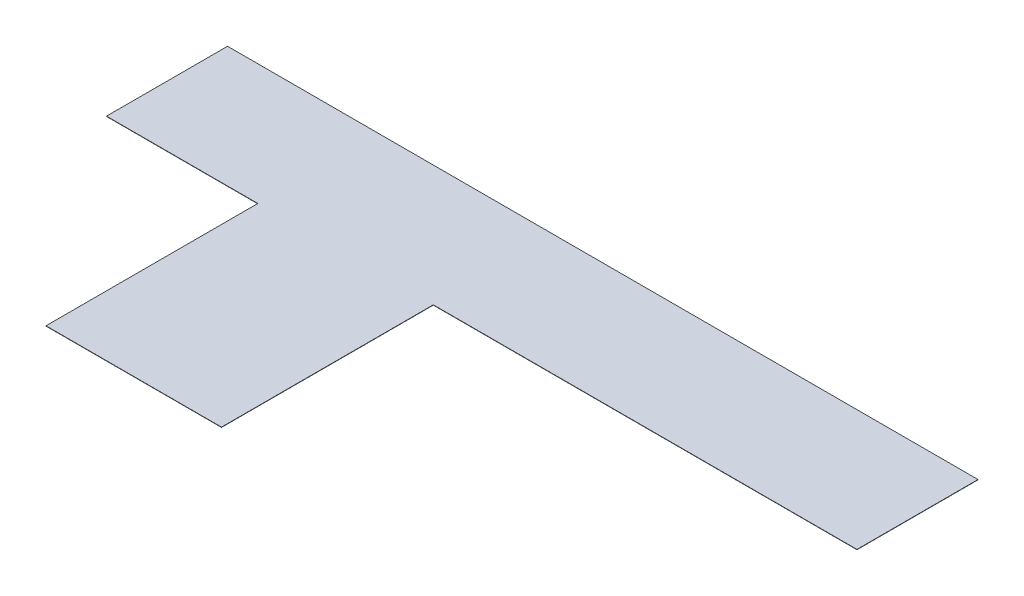
ISO-10303-21;
HEADER;
FILE_DESCRIPTION(('STEP AP214'),'2;1');
FILE_NAME('part.step','',(''),(''),'','','');
FILE_SCHEMA(('AUTOMOTIVE_DESIGN { 1 0 10303 214 1 1 1 1 }'));
ENDSEC;
DATA;
#1=APPLICATION_CONTEXT('core data for automotive mechanical design processes');
#2=APPLICATION_PROTOCOL_DEFINITION('international standard','automotive_design',2000,#1);
#3=PRODUCT_CONTEXT('',#1,'mechanical');
#4=PRODUCT('Part','Part','',(#3));
#5=PRODUCT_RELATED_PRODUCT_CATEGORY('part','',(#4));
#6=PRODUCT_DEFINITION_FORMATION('','',#4);
#7=PRODUCT_DEFINITION_CONTEXT('part definition',#1,'design');
#8=PRODUCT_DEFINITION('design','',#6,#7);
#9=PRODUCT_DEFINITION_SHAPE('','',#8);
#10=(LENGTH_UNIT() NAMED_UNIT(*) SI_UNIT(.MILLI.,.METRE.));
#11=(NAMED_UNIT(*) PLANE_ANGLE_UNIT() SI_UNIT($,.RADIAN.));
#12=(NAMED_UNIT(*) SI_UNIT($,.STERADIAN.) SOLID_ANGLE_UNIT());
#13=UNCERTAINTY_MEASURE_WITH_UNIT(LENGTH_MEASURE(1.E-05),#10,'distance_accuracy_value','');
#14=(GEOMETRIC_REPRESENTATION_CONTEXT(3) GLOBAL_UNCERTAINTY_ASSIGNED_CONTEXT((#13)) GLOBAL_UNIT_ASSIGNED_CONTEXT((#10,
#11,#12)) REPRESENTATION_CONTEXT('',''));
#15=CARTESIAN_POINT('',(0.,0.,0.));
#16=DIRECTION('',(0.,0.,1.));
#17=DIRECTION('',(1.,0.,0.));
#18=AXIS2_PLACEMENT_3D('',#15,#16,#17);
#19=CARTESIAN_POINT('',(-6200.,5.,1000.));
#20=DIRECTION('',(1.,0.,0.));
#21=DIRECTION('',(0.,0.,-1.));
#22=AXIS2_PLACEMENT_3D('',#19,#20,#21);
#23=PLANE('',#22);
#24=DIRECTION('',(0.,0.,1.));
#25=VECTOR('',#24,1.);
#26=CARTESIAN_POINT('',(-6200.,0.,1000.));
#27=LINE('',#26,#25);
#28=CARTESIAN_POINT('',(-6200.,0.,-1000.));
#29=VERTEX_POINT('',#28);
#30=CARTESIAN_POINT('',(-6200.,0.,1000.));
#31=VERTEX_POINT('',#30);
#32=EDGE_CURVE('E129',#29,#31,#27,.T.);
#33=ORIENTED_EDGE('',*,*,#32,.T.);
#34=DIRECTION('',(0.,-1.,0.));
#35=VECTOR('',#34,1.);
#36=CARTESIAN_POINT('',(-6200.,5.,1000.));
#37=LINE('',#36,#35);
#38=CARTESIAN_POINT('',(-6200.,5.,1000.));
#39=VERTEX_POINT('',#38);
#40=EDGE_CURVE('E11',#39,#31,#37,.T.);
#41=ORIENTED_EDGE('',*,*,#40,.F.);
#42=DIRECTION('',(0.,0.,1.));
#43=VECTOR('',#42,1.);
#44=CARTESIAN_POINT('',(-6200.,5.,1000.));
#45=LINE('',#44,#43);
#46=CARTESIAN_POINT('',(-6200.,5.,-1000.));
#47=VERTEX_POINT('',#46);
#48=EDGE_CURVE('E143',#47,#39,#45,.T.);
#49=ORIENTED_EDGE('',*,*,#48,.F.);
#50=DIRECTION('',(0.,-1.,0.));
#51=VECTOR('',#50,1.);
#52=CARTESIAN_POINT('',(-6200.,5.,-1000.));
#53=LINE('',#52,#51);
#54=EDGE_CURVE('E125',#47,#29,#53,.T.);
#55=ORIENTED_EDGE('',*,*,#54,.T.);
#56=EDGE_LOOP('',(#33,#41,#49,#55));
#57=FACE_BOUND('',#56,.T.);
#58=ADVANCED_FACE('F33',(#57),#23,.F.);
#59=CARTESIAN_POINT('',(-3700.,5.,1000.));
#60=DIRECTION('',(0.,0.,-1.));
#61=DIRECTION('',(-1.,0.,0.));
#62=AXIS2_PLACEMENT_3D('',#59,#60,#61);
#63=PLANE('',#62);
#64=DIRECTION('',(1.,0.,0.));
#65=VECTOR('',#64,1.);
#66=CARTESIAN_POINT('',(-3700.,0.,1000.));
#67=LINE('',#66,#65);
#68=CARTESIAN_POINT('',(-3700.,0.,1000.));
#69=VERTEX_POINT('',#68);
#70=EDGE_CURVE('E132',#31,#69,#67,.T.);
#71=ORIENTED_EDGE('',*,*,#70,.T.);
#72=DIRECTION('',(0.,-1.,0.));
#73=VECTOR('',#72,1.);
#74=CARTESIAN_POINT('',(-3700.,5.,1000.));
#75=LINE('',#74,#73);
#76=CARTESIAN_POINT('',(-3700.,5.,1000.));
#77=VERTEX_POINT('',#76);
#78=EDGE_CURVE('E41',#77,#69,#75,.T.);
#79=ORIENTED_EDGE('',*,*,#78,.F.);
#80=DIRECTION('',(1.,0.,0.));
#81=VECTOR('',#80,1.);
#82=CARTESIAN_POINT('',(-3700.,5.,1000.));
#83=LINE('',#82,#81);
#84=EDGE_CURVE('E92',#39,#77,#83,.T.);
#85=ORIENTED_EDGE('',*,*,#84,.F.);
#86=ORIENTED_EDGE('',*,*,#40,.T.);
#87=EDGE_LOOP('',(#71,#79,#85,#86));
#88=FACE_BOUND('',#87,.T.);
#89=ADVANCED_FACE('F178',(#88),#63,.F.);
#90=CARTESIAN_POINT('',(-3700.,5.,1000.));
#91=DIRECTION('',(1.,0.,0.));
#92=DIRECTION('',(0.,0.,-1.));
#93=AXIS2_PLACEMENT_3D('',#90,#91,#92);
#94=PLANE('',#93);
#95=DIRECTION('',(0.,0.,1.));
#96=VECTOR('',#95,1.);
#97=CARTESIAN_POINT('',(-3700.,0.,1000.));
#98=LINE('',#97,#96);
#99=CARTESIAN_POINT('',(-3700.,0.,4500.));
#100=VERTEX_POINT('',#99);
#101=EDGE_CURVE('E134',#69,#100,#98,.T.);
#102=ORIENTED_EDGE('',*,*,#101,.T.);
#103=DIRECTION('',(0.,-1.,0.));
#104=VECTOR('',#103,1.);
#105=CARTESIAN_POINT('',(-3700.,5.,4500.));
#106=LINE('',#105,#104);
#107=CARTESIAN_POINT('',(-3700.,5.,4500.));
#108=VERTEX_POINT('',#107);
#109=EDGE_CURVE('E150',#108,#100,#106,.T.);
#110=ORIENTED_EDGE('',*,*,#109,.F.);
#111=DIRECTION('',(0.,0.,1.));
#112=VECTOR('',#111,1.);
#113=CARTESIAN_POINT('',(-3700.,5.,1000.));
#114=LINE('',#113,#112);
#115=EDGE_CURVE('E158',#77,#108,#114,.T.);
#116=ORIENTED_EDGE('',*,*,#115,.F.);
#117=ORIENTED_EDGE('',*,*,#78,.T.);
#118=EDGE_LOOP('',(#102,#110,#116,#117));
#119=FACE_BOUND('',#118,.T.);
#120=ADVANCED_FACE('F156',(#119),#94,.F.);
#121=CARTESIAN_POINT('',(-3700.,5.,4500.));
#122=DIRECTION('',(0.,0.,-1.));
#123=DIRECTION('',(-1.,0.,0.));
#124=AXIS2_PLACEMENT_3D('',#121,#122,#123);
#125=PLANE('',#124);
#126=DIRECTION('',(1.,0.,0.));
#127=VECTOR('',#126,1.);
#128=CARTESIAN_POINT('',(-3700.,0.,4500.));
#129=LINE('',#128,#127);
#130=CARTESIAN_POINT('',(-800.000000000001,0.,4500.));
#131=VERTEX_POINT('',#130);
#132=EDGE_CURVE('E136',#100,#131,#129,.T.);
#133=ORIENTED_EDGE('',*,*,#132,.T.);
#134=DIRECTION('',(0.,-1.,0.));
#135=VECTOR('',#134,1.);
#136=CARTESIAN_POINT('',(-800.000000000001,5.,4500.));
#137=LINE('',#136,#135);
#138=CARTESIAN_POINT('',(-800.000000000001,5.,4500.));
#139=VERTEX_POINT('',#138);
#140=EDGE_CURVE('E147',#139,#131,#137,.T.);
#141=ORIENTED_EDGE('',*,*,#140,.F.);
#142=DIRECTION('',(1.,0.,0.));
#143=VECTOR('',#142,1.);
#144=CARTESIAN_POINT('',(-3700.,5.,4500.));
#145=LINE('',#144,#143);
#146=EDGE_CURVE('E170',#108,#139,#145,.T.);
#147=ORIENTED_EDGE('',*,*,#146,.F.);
#148=ORIENTED_EDGE('',*,*,#109,.T.);
#149=EDGE_LOOP('',(#133,#141,#147,#148));
#150=FACE_BOUND('',#149,.T.);
#151=ADVANCED_FACE('F166',(#150),#125,.F.);
#152=CARTESIAN_POINT('',(-800.000000000001,5.,1000.));
#153=DIRECTION('',(-1.,0.,0.));
#154=DIRECTION('',(0.,0.,1.));
#155=AXIS2_PLACEMENT_3D('',#152,#153,#154);
#156=PLANE('',#155);
#157=DIRECTION('',(0.,0.,-1.));
#158=VECTOR('',#157,1.);
#159=CARTESIAN_POINT('',(-800.000000000001,0.,1000.));
#160=LINE('',#159,#158);
#161=CARTESIAN_POINT('',(-800.000000000001,0.,1000.));
#162=VERTEX_POINT('',#161);
#163=EDGE_CURVE('E138',#131,#162,#160,.T.);
#164=ORIENTED_EDGE('',*,*,#163,.T.);
#165=DIRECTION('',(0.,-1.,0.));
#166=VECTOR('',#165,1.);
#167=CARTESIAN_POINT('',(-800.000000000001,5.,1000.));
#168=LINE('',#167,#166);
#169=CARTESIAN_POINT('',(-800.000000000001,5.,1000.));
#170=VERTEX_POINT('',#169);
#171=EDGE_CURVE('E120',#170,#162,#168,.T.);
#172=ORIENTED_EDGE('',*,*,#171,.F.);
#173=DIRECTION('',(0.,0.,-1.));
#174=VECTOR('',#173,1.);
#175=CARTESIAN_POINT('',(-800.000000000001,5.,1000.));
#176=LINE('',#175,#174);
#177=EDGE_CURVE('E111',#139,#170,#176,.T.);
#178=ORIENTED_EDGE('',*,*,#177,.F.);
#179=ORIENTED_EDGE('',*,*,#140,.T.);
#180=EDGE_LOOP('',(#164,#172,#178,#179));
#181=FACE_BOUND('',#180,.T.);
#182=ADVANCED_FACE('F169',(#181),#156,.F.);
#183=CARTESIAN_POINT('',(6200.,5.,999.999999999999));
#184=DIRECTION('',(0.,0.,-1.));
#185=DIRECTION('',(-1.,0.,0.));
#186=AXIS2_PLACEMENT_3D('',#183,#184,#185);
#187=PLANE('',#186);
#188=DIRECTION('',(1.,0.,0.));
#189=VECTOR('',#188,1.);
#190=CARTESIAN_POINT('',(6200.,0.,999.999999999999));
#191=LINE('',#190,#189);
#192=CARTESIAN_POINT('',(6200.,0.,999.999999999999));
#193=VERTEX_POINT('',#192);
#194=EDGE_CURVE('E119',#162,#193,#191,.T.);
#195=ORIENTED_EDGE('',*,*,#194,.T.);
#196=DIRECTION('',(0.,-1.,0.));
#197=VECTOR('',#196,1.);
#198=CARTESIAN_POINT('',(6200.,5.,999.999999999999));
#199=LINE('',#198,#197);
#200=CARTESIAN_POINT('',(6200.,5.,999.999999999999));
#201=VERTEX_POINT('',#200);
#202=EDGE_CURVE('E116',#201,#193,#199,.T.);
#203=ORIENTED_EDGE('',*,*,#202,.F.);
#204=DIRECTION('',(1.,0.,0.));
#205=VECTOR('',#204,1.);
#206=CARTESIAN_POINT('',(6200.,5.,999.999999999999));
#207=LINE('',#206,#205);
#208=EDGE_CURVE('E105',#170,#201,#207,.T.);
#209=ORIENTED_EDGE('',*,*,#208,.F.);
#210=ORIENTED_EDGE('',*,*,#171,.T.);
#211=EDGE_LOOP('',(#195,#203,#209,#210));
#212=FACE_BOUND('',#211,.T.);
#213=ADVANCED_FACE('F117',(#212),#187,.F.);
#214=CARTESIAN_POINT('',(6200.,5.,999.999999999999));
#215=DIRECTION('',(-1.,0.,0.));
#216=DIRECTION('',(0.,0.,1.));
#217=AXIS2_PLACEMENT_3D('',#214,#215,#216);
#218=PLANE('',#217);
#219=DIRECTION('',(0.,0.,-1.));
#220=VECTOR('',#219,1.);
#221=CARTESIAN_POINT('',(6200.,0.,999.999999999999));
#222=LINE('',#221,#220);
#223=CARTESIAN_POINT('',(6200.,0.,-1000.));
#224=VERTEX_POINT('',#223);
#225=EDGE_CURVE('E78',#193,#224,#222,.T.);
#226=ORIENTED_EDGE('',*,*,#225,.T.);
#227=DIRECTION('',(0.,-1.,0.));
#228=VECTOR('',#227,1.);
#229=CARTESIAN_POINT('',(6200.,5.,-1000.));
#230=LINE('',#229,#228);
#231=CARTESIAN_POINT('',(6200.,5.,-1000.));
#232=VERTEX_POINT('',#231);
#233=EDGE_CURVE('E121',#232,#224,#230,.T.);
#234=ORIENTED_EDGE('',*,*,#233,.F.);
#235=DIRECTION('',(0.,0.,-1.));
#236=VECTOR('',#235,1.);
#237=CARTESIAN_POINT('',(6200.,5.,999.999999999999));
#238=LINE('',#237,#236);
#239=EDGE_CURVE('E109',#201,#232,#238,.T.);
#240=ORIENTED_EDGE('',*,*,#239,.F.);
#241=ORIENTED_EDGE('',*,*,#202,.T.);
#242=EDGE_LOOP('',(#226,#234,#240,#241));
#243=FACE_BOUND('',#242,.T.);
#244=ADVANCED_FACE('F123',(#243),#218,.F.);
#245=CARTESIAN_POINT('',(6200.,5.,-1000.));
#246=DIRECTION('',(0.,0.,1.));
#247=DIRECTION('',(1.,0.,0.));
#248=AXIS2_PLACEMENT_3D('',#245,#246,#247);
#249=PLANE('',#248);
#250=DIRECTION('',(-1.,0.,0.));
#251=VECTOR('',#250,1.);
#252=CARTESIAN_POINT('',(6200.,0.,-1000.));
#253=LINE('',#252,#251);
#254=EDGE_CURVE('E84',#224,#29,#253,.T.);
#255=ORIENTED_EDGE('',*,*,#254,.T.);
#256=ORIENTED_EDGE('',*,*,#54,.F.);
#257=DIRECTION('',(-1.,0.,0.));
#258=VECTOR('',#257,1.);
#259=CARTESIAN_POINT('',(6200.,5.,-1000.));
#260=LINE('',#259,#258);
#261=EDGE_CURVE('E49',#232,#47,#260,.T.);
#262=ORIENTED_EDGE('',*,*,#261,.F.);
#263=ORIENTED_EDGE('',*,*,#233,.T.);
#264=EDGE_LOOP('',(#255,#256,#262,#263));
#265=FACE_BOUND('',#264,.T.);
#266=ADVANCED_FACE('F194',(#265),#249,.F.);
#267=CARTESIAN_POINT('',(0.,5.,0.));
#268=DIRECTION('',(0.,1.,0.));
#269=DIRECTION('',(0.,0.,1.));
#270=AXIS2_PLACEMENT_3D('',#267,#268,#269);
#271=PLANE('',#270);
#272=ORIENTED_EDGE('',*,*,#48,.T.);
#273=ORIENTED_EDGE('',*,*,#84,.T.);
#274=ORIENTED_EDGE('',*,*,#115,.T.);
#275=ORIENTED_EDGE('',*,*,#146,.T.);
#276=ORIENTED_EDGE('',*,*,#177,.T.);
#277=ORIENTED_EDGE('',*,*,#208,.T.);
#278=ORIENTED_EDGE('',*,*,#239,.T.);
#279=ORIENTED_EDGE('',*,*,#261,.T.);
#280=EDGE_LOOP('',(#272,#273,#274,#275,#276,#277,#278,#279));
#281=FACE_BOUND('',#280,.T.);
#282=ADVANCED_FACE('F107',(#281),#271,.T.);
#283=CARTESIAN_POINT('',(0.,0.,0.));
#284=DIRECTION('',(0.,1.,0.));
#285=DIRECTION('',(0.,0.,1.));
#286=AXIS2_PLACEMENT_3D('',#283,#284,#285);
#287=PLANE('',#286);
#288=ORIENTED_EDGE('',*,*,#32,.F.);
#289=ORIENTED_EDGE('',*,*,#254,.F.);
#290=ORIENTED_EDGE('',*,*,#225,.F.);
#291=ORIENTED_EDGE('',*,*,#194,.F.);
#292=ORIENTED_EDGE('',*,*,#163,.F.);
#293=ORIENTED_EDGE('',*,*,#132,.F.);
#294=ORIENTED_EDGE('',*,*,#101,.F.);
#295=ORIENTED_EDGE('',*,*,#70,.F.);
#296=EDGE_LOOP('',(#288,#289,#290,#291,#292,#293,#294,#295));
#297=FACE_BOUND('',#296,.T.);
#298=ADVANCED_FACE('F162',(#297),#287,.F.);
#299=CLOSED_SHELL('',(#58,#89,#120,#151,#182,#213,#244,#266,#282,#298));
#300=MANIFOLD_SOLID_BREP('B2',#299);
#301=ADVANCED_BREP_SHAPE_REPRESENTATION('',(#18,#300),#14);
#302=SHAPE_DEFINITION_REPRESENTATION(#9,#301);
ENDSEC;
END-ISO-10303-21;
